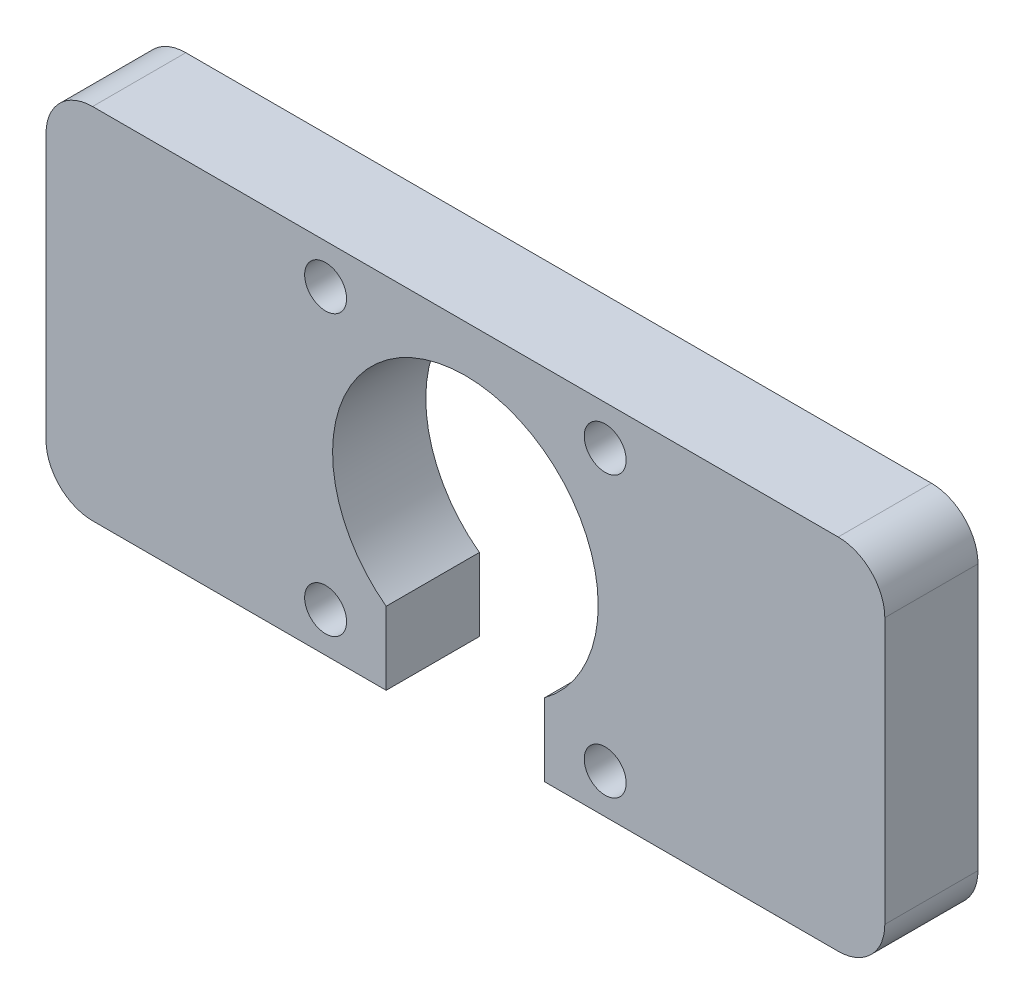
ISO-10303-21;
HEADER;
FILE_DESCRIPTION(('STEP AP214'),'2;1');
FILE_NAME('part.step','',(''),(''),'','','');
FILE_SCHEMA(('AUTOMOTIVE_DESIGN { 1 0 10303 214 1 1 1 1 }'));
ENDSEC;
DATA;
#1=APPLICATION_CONTEXT('core data for automotive mechanical design processes');
#2=APPLICATION_PROTOCOL_DEFINITION('international standard','automotive_design',2000,#1);
#3=PRODUCT_CONTEXT('',#1,'mechanical');
#4=PRODUCT('Part','Part','',(#3));
#5=PRODUCT_RELATED_PRODUCT_CATEGORY('part','',(#4));
#6=PRODUCT_DEFINITION_FORMATION('','',#4);
#7=PRODUCT_DEFINITION_CONTEXT('part definition',#1,'design');
#8=PRODUCT_DEFINITION('design','',#6,#7);
#9=PRODUCT_DEFINITION_SHAPE('','',#8);
#10=(LENGTH_UNIT() NAMED_UNIT(*) SI_UNIT(.MILLI.,.METRE.));
#11=(NAMED_UNIT(*) PLANE_ANGLE_UNIT() SI_UNIT($,.RADIAN.));
#12=(NAMED_UNIT(*) SI_UNIT($,.STERADIAN.) SOLID_ANGLE_UNIT());
#13=UNCERTAINTY_MEASURE_WITH_UNIT(LENGTH_MEASURE(1.E-05),#10,'distance_accuracy_value','');
#14=(GEOMETRIC_REPRESENTATION_CONTEXT(3) GLOBAL_UNCERTAINTY_ASSIGNED_CONTEXT((#13)) GLOBAL_UNIT_ASSIGNED_CONTEXT((#10,
#11,#12)) REPRESENTATION_CONTEXT('',''));
#15=CARTESIAN_POINT('',(0.,0.,0.));
#16=DIRECTION('',(0.,0.,1.));
#17=DIRECTION('',(1.,0.,0.));
#18=AXIS2_PLACEMENT_3D('',#15,#16,#17);
#19=CARTESIAN_POINT('',(0.,-19.2499999999987,10.));
#20=DIRECTION('',(0.,1.,0.));
#21=DIRECTION('',(0.,0.,1.));
#22=AXIS2_PLACEMENT_3D('',#19,#20,#21);
#23=PLANE('',#22);
#24=DIRECTION('',(1.,0.,0.));
#25=VECTOR('',#24,1.);
#26=CARTESIAN_POINT('',(0.,-19.2499999999987,0.));
#27=LINE('',#26,#25);
#28=CARTESIAN_POINT('',(8.5,-19.2499999999987,0.));
#29=VERTEX_POINT('',#28);
#30=CARTESIAN_POINT('',(40.0000000000002,-19.2499999999987,0.));
#31=VERTEX_POINT('',#30);
#32=EDGE_CURVE('E169',#29,#31,#27,.T.);
#33=ORIENTED_EDGE('',*,*,#32,.T.);
#34=DIRECTION('',(0.,0.,-1.));
#35=VECTOR('',#34,1.);
#36=CARTESIAN_POINT('',(40.0000000000002,-19.2499999999987,10.));
#37=LINE('',#36,#35);
#38=CARTESIAN_POINT('',(40.0000000000002,-19.2499999999987,10.));
#39=VERTEX_POINT('',#38);
#40=EDGE_CURVE('E11',#39,#31,#37,.T.);
#41=ORIENTED_EDGE('',*,*,#40,.F.);
#42=DIRECTION('',(1.,0.,0.));
#43=VECTOR('',#42,1.);
#44=CARTESIAN_POINT('',(0.,-19.2499999999987,10.));
#45=LINE('',#44,#43);
#46=CARTESIAN_POINT('',(8.5,-19.2499999999987,10.));
#47=VERTEX_POINT('',#46);
#48=EDGE_CURVE('E239',#47,#39,#45,.T.);
#49=ORIENTED_EDGE('',*,*,#48,.F.);
#50=DIRECTION('',(0.,0.,-1.));
#51=VECTOR('',#50,1.);
#52=CARTESIAN_POINT('',(8.5,-19.2499999999987,10.));
#53=LINE('',#52,#51);
#54=EDGE_CURVE('E52',#47,#29,#53,.T.);
#55=ORIENTED_EDGE('',*,*,#54,.T.);
#56=EDGE_LOOP('',(#33,#41,#49,#55));
#57=FACE_BOUND('',#56,.T.);
#58=ADVANCED_FACE('F35',(#57),#23,.F.);
#59=CARTESIAN_POINT('',(40.0000000000002,-14.2499999999987,10.));
#60=DIRECTION('',(0.,0.,-1.));
#61=DIRECTION('',(-1.,0.,0.));
#62=AXIS2_PLACEMENT_3D('',#59,#60,#61);
#63=CYLINDRICAL_SURFACE('',#62,5.);
#64=CARTESIAN_POINT('',(40.0000000000002,-14.2499999999987,0.));
#65=DIRECTION('',(0.,0.,1.));
#66=DIRECTION('',(1.,0.,0.));
#67=AXIS2_PLACEMENT_3D('',#64,#65,#66);
#68=CIRCLE('',#67,5.);
#69=CARTESIAN_POINT('',(45.0000000000002,-14.2499999999987,0.));
#70=VERTEX_POINT('',#69);
#71=EDGE_CURVE('E171',#31,#70,#68,.T.);
#72=ORIENTED_EDGE('',*,*,#71,.T.);
#73=DIRECTION('',(0.,0.,-1.));
#74=VECTOR('',#73,1.);
#75=CARTESIAN_POINT('',(45.0000000000002,-14.2499999999987,10.));
#76=LINE('',#75,#74);
#77=CARTESIAN_POINT('',(45.0000000000002,-14.2499999999987,10.));
#78=VERTEX_POINT('',#77);
#79=EDGE_CURVE('E44',#78,#70,#76,.T.);
#80=ORIENTED_EDGE('',*,*,#79,.F.);
#81=CARTESIAN_POINT('',(40.0000000000002,-14.2499999999987,10.));
#82=DIRECTION('',(0.,0.,1.));
#83=DIRECTION('',(1.,0.,0.));
#84=AXIS2_PLACEMENT_3D('',#81,#82,#83);
#85=CIRCLE('',#84,5.);
#86=EDGE_CURVE('E102',#39,#78,#85,.T.);
#87=ORIENTED_EDGE('',*,*,#86,.F.);
#88=ORIENTED_EDGE('',*,*,#40,.T.);
#89=EDGE_LOOP('',(#72,#80,#87,#88));
#90=FACE_BOUND('',#89,.T.);
#91=ADVANCED_FACE('F222',(#90),#63,.T.);
#92=CARTESIAN_POINT('',(45.0000000000002,0.,10.));
#93=DIRECTION('',(1.,0.,0.));
#94=DIRECTION('',(0.,0.,-1.));
#95=AXIS2_PLACEMENT_3D('',#92,#93,#94);
#96=PLANE('',#95);
#97=DIRECTION('',(0.,-1.,0.));
#98=VECTOR('',#97,1.);
#99=CARTESIAN_POINT('',(45.0000000000002,0.,0.));
#100=LINE('',#99,#98);
#101=CARTESIAN_POINT('',(45.0000000000002,14.2499999999981,0.));
#102=VERTEX_POINT('',#101);
#103=EDGE_CURVE('E174',#102,#70,#100,.T.);
#104=ORIENTED_EDGE('',*,*,#103,.F.);
#105=DIRECTION('',(0.,0.,-1.));
#106=VECTOR('',#105,1.);
#107=CARTESIAN_POINT('',(45.0000000000002,14.2499999999981,10.));
#108=LINE('',#107,#106);
#109=CARTESIAN_POINT('',(45.0000000000002,14.2499999999981,10.));
#110=VERTEX_POINT('',#109);
#111=EDGE_CURVE('E215',#110,#102,#108,.T.);
#112=ORIENTED_EDGE('',*,*,#111,.F.);
#113=DIRECTION('',(0.,-1.,0.));
#114=VECTOR('',#113,1.);
#115=CARTESIAN_POINT('',(45.0000000000002,0.,10.));
#116=LINE('',#115,#114);
#117=EDGE_CURVE('E221',#110,#78,#116,.T.);
#118=ORIENTED_EDGE('',*,*,#117,.T.);
#119=ORIENTED_EDGE('',*,*,#79,.T.);
#120=EDGE_LOOP('',(#104,#112,#118,#119));
#121=FACE_BOUND('',#120,.T.);
#122=ADVANCED_FACE('F219',(#121),#96,.T.);
#123=CARTESIAN_POINT('',(40.0000000000002,14.2499999999982,10.));
#124=DIRECTION('',(0.,0.,-1.));
#125=DIRECTION('',(-1.,0.,0.));
#126=AXIS2_PLACEMENT_3D('',#123,#124,#125);
#127=CYLINDRICAL_SURFACE('',#126,5.);
#128=CARTESIAN_POINT('',(40.0000000000002,14.2499999999982,0.));
#129=DIRECTION('',(0.,0.,1.));
#130=DIRECTION('',(1.,0.,0.));
#131=AXIS2_PLACEMENT_3D('',#128,#129,#130);
#132=CIRCLE('',#131,5.);
#133=CARTESIAN_POINT('',(40.0000000000002,19.2499999999982,0.));
#134=VERTEX_POINT('',#133);
#135=EDGE_CURVE('E177',#134,#102,#132,.F.);
#136=ORIENTED_EDGE('',*,*,#135,.F.);
#137=DIRECTION('',(0.,0.,-1.));
#138=VECTOR('',#137,1.);
#139=CARTESIAN_POINT('',(40.0000000000002,19.2499999999982,10.));
#140=LINE('',#139,#138);
#141=CARTESIAN_POINT('',(40.0000000000002,19.2499999999982,10.));
#142=VERTEX_POINT('',#141);
#143=EDGE_CURVE('E213',#142,#134,#140,.T.);
#144=ORIENTED_EDGE('',*,*,#143,.F.);
#145=CARTESIAN_POINT('',(40.0000000000002,14.2499999999982,10.));
#146=DIRECTION('',(0.,0.,1.));
#147=DIRECTION('',(1.,0.,0.));
#148=AXIS2_PLACEMENT_3D('',#145,#146,#147);
#149=CIRCLE('',#148,5.);
#150=EDGE_CURVE('E233',#142,#110,#149,.F.);
#151=ORIENTED_EDGE('',*,*,#150,.T.);
#152=ORIENTED_EDGE('',*,*,#111,.T.);
#153=EDGE_LOOP('',(#136,#144,#151,#152));
#154=FACE_BOUND('',#153,.T.);
#155=ADVANCED_FACE('F230',(#154),#127,.T.);
#156=CARTESIAN_POINT('',(0.,19.2499999999982,10.));
#157=DIRECTION('',(0.,1.,0.));
#158=DIRECTION('',(0.,0.,1.));
#159=AXIS2_PLACEMENT_3D('',#156,#157,#158);
#160=PLANE('',#159);
#161=DIRECTION('',(1.,0.,0.));
#162=VECTOR('',#161,1.);
#163=CARTESIAN_POINT('',(0.,19.2499999999982,0.));
#164=LINE('',#163,#162);
#165=CARTESIAN_POINT('',(-40.0000000000002,19.2499999999982,0.));
#166=VERTEX_POINT('',#165);
#167=EDGE_CURVE('E180',#166,#134,#164,.T.);
#168=ORIENTED_EDGE('',*,*,#167,.F.);
#169=DIRECTION('',(0.,0.,-1.));
#170=VECTOR('',#169,1.);
#171=CARTESIAN_POINT('',(-40.0000000000002,19.2499999999982,10.));
#172=LINE('',#171,#170);
#173=CARTESIAN_POINT('',(-40.0000000000002,19.2499999999982,10.));
#174=VERTEX_POINT('',#173);
#175=EDGE_CURVE('E211',#174,#166,#172,.T.);
#176=ORIENTED_EDGE('',*,*,#175,.F.);
#177=DIRECTION('',(1.,0.,0.));
#178=VECTOR('',#177,1.);
#179=CARTESIAN_POINT('',(0.,19.2499999999982,10.));
#180=LINE('',#179,#178);
#181=EDGE_CURVE('E237',#174,#142,#180,.T.);
#182=ORIENTED_EDGE('',*,*,#181,.T.);
#183=ORIENTED_EDGE('',*,*,#143,.T.);
#184=EDGE_LOOP('',(#168,#176,#182,#183));
#185=FACE_BOUND('',#184,.T.);
#186=ADVANCED_FACE('F391',(#185),#160,.T.);
#187=CARTESIAN_POINT('',(-40.0000000000002,14.2499999999982,10.));
#188=DIRECTION('',(0.,0.,-1.));
#189=DIRECTION('',(-1.,0.,0.));
#190=AXIS2_PLACEMENT_3D('',#187,#188,#189);
#191=CYLINDRICAL_SURFACE('',#190,5.);
#192=CARTESIAN_POINT('',(-40.0000000000002,14.2499999999982,0.));
#193=DIRECTION('',(0.,0.,1.));
#194=DIRECTION('',(1.,0.,0.));
#195=AXIS2_PLACEMENT_3D('',#192,#193,#194);
#196=CIRCLE('',#195,5.);
#197=CARTESIAN_POINT('',(-45.0000000000002,14.2499999999981,0.));
#198=VERTEX_POINT('',#197);
#199=EDGE_CURVE('E183',#166,#198,#196,.T.);
#200=ORIENTED_EDGE('',*,*,#199,.T.);
#201=DIRECTION('',(0.,0.,-1.));
#202=VECTOR('',#201,1.);
#203=CARTESIAN_POINT('',(-45.0000000000002,14.2499999999981,10.));
#204=LINE('',#203,#202);
#205=CARTESIAN_POINT('',(-45.0000000000002,14.2499999999981,10.));
#206=VERTEX_POINT('',#205);
#207=EDGE_CURVE('E208',#206,#198,#204,.T.);
#208=ORIENTED_EDGE('',*,*,#207,.F.);
#209=CARTESIAN_POINT('',(-40.0000000000002,14.2499999999982,10.));
#210=DIRECTION('',(0.,0.,1.));
#211=DIRECTION('',(1.,0.,0.));
#212=AXIS2_PLACEMENT_3D('',#209,#210,#211);
#213=CIRCLE('',#212,5.);
#214=EDGE_CURVE('E244',#174,#206,#213,.T.);
#215=ORIENTED_EDGE('',*,*,#214,.F.);
#216=ORIENTED_EDGE('',*,*,#175,.T.);
#217=EDGE_LOOP('',(#200,#208,#215,#216));
#218=FACE_BOUND('',#217,.T.);
#219=ADVANCED_FACE('F381',(#218),#191,.T.);
#220=CARTESIAN_POINT('',(-45.0000000000002,0.,10.));
#221=DIRECTION('',(1.,0.,0.));
#222=DIRECTION('',(0.,0.,-1.));
#223=AXIS2_PLACEMENT_3D('',#220,#221,#222);
#224=PLANE('',#223);
#225=DIRECTION('',(0.,-1.,0.));
#226=VECTOR('',#225,1.);
#227=CARTESIAN_POINT('',(-45.0000000000002,0.,0.));
#228=LINE('',#227,#226);
#229=CARTESIAN_POINT('',(-45.0000000000002,-14.2499999999987,0.));
#230=VERTEX_POINT('',#229);
#231=EDGE_CURVE('E185',#198,#230,#228,.T.);
#232=ORIENTED_EDGE('',*,*,#231,.T.);
#233=DIRECTION('',(0.,0.,-1.));
#234=VECTOR('',#233,1.);
#235=CARTESIAN_POINT('',(-45.0000000000002,-14.2499999999987,10.));
#236=LINE('',#235,#234);
#237=CARTESIAN_POINT('',(-45.0000000000002,-14.2499999999987,10.));
#238=VERTEX_POINT('',#237);
#239=EDGE_CURVE('E206',#238,#230,#236,.T.);
#240=ORIENTED_EDGE('',*,*,#239,.F.);
#241=DIRECTION('',(0.,-1.,0.));
#242=VECTOR('',#241,1.);
#243=CARTESIAN_POINT('',(-45.0000000000002,0.,10.));
#244=LINE('',#243,#242);
#245=EDGE_CURVE('E246',#206,#238,#244,.T.);
#246=ORIENTED_EDGE('',*,*,#245,.F.);
#247=ORIENTED_EDGE('',*,*,#207,.T.);
#248=EDGE_LOOP('',(#232,#240,#246,#247));
#249=FACE_BOUND('',#248,.T.);
#250=ADVANCED_FACE('F370',(#249),#224,.F.);
#251=CARTESIAN_POINT('',(-40.0000000000002,-14.2499999999987,10.));
#252=DIRECTION('',(0.,0.,-1.));
#253=DIRECTION('',(-1.,0.,0.));
#254=AXIS2_PLACEMENT_3D('',#251,#252,#253);
#255=CYLINDRICAL_SURFACE('',#254,5.);
#256=CARTESIAN_POINT('',(-40.0000000000002,-14.2499999999987,0.));
#257=DIRECTION('',(0.,0.,1.));
#258=DIRECTION('',(1.,0.,0.));
#259=AXIS2_PLACEMENT_3D('',#256,#257,#258);
#260=CIRCLE('',#259,5.);
#261=CARTESIAN_POINT('',(-40.0000000000002,-19.2499999999987,0.));
#262=VERTEX_POINT('',#261);
#263=EDGE_CURVE('E188',#262,#230,#260,.F.);
#264=ORIENTED_EDGE('',*,*,#263,.F.);
#265=DIRECTION('',(0.,0.,-1.));
#266=VECTOR('',#265,1.);
#267=CARTESIAN_POINT('',(-40.0000000000002,-19.2499999999987,10.));
#268=LINE('',#267,#266);
#269=CARTESIAN_POINT('',(-40.0000000000002,-19.2499999999987,10.));
#270=VERTEX_POINT('',#269);
#271=EDGE_CURVE('E204',#270,#262,#268,.T.);
#272=ORIENTED_EDGE('',*,*,#271,.F.);
#273=CARTESIAN_POINT('',(-40.0000000000002,-14.2499999999987,10.));
#274=DIRECTION('',(0.,0.,1.));
#275=DIRECTION('',(1.,0.,0.));
#276=AXIS2_PLACEMENT_3D('',#273,#274,#275);
#277=CIRCLE('',#276,5.);
#278=EDGE_CURVE('E248',#270,#238,#277,.F.);
#279=ORIENTED_EDGE('',*,*,#278,.T.);
#280=ORIENTED_EDGE('',*,*,#239,.T.);
#281=EDGE_LOOP('',(#264,#272,#279,#280));
#282=FACE_BOUND('',#281,.T.);
#283=ADVANCED_FACE('F360',(#282),#255,.T.);
#284=CARTESIAN_POINT('',(0.,-19.2499999999987,10.));
#285=DIRECTION('',(0.,-1.,0.));
#286=DIRECTION('',(0.,0.,-1.));
#287=AXIS2_PLACEMENT_3D('',#284,#285,#286);
#288=PLANE('',#287);
#289=DIRECTION('',(-1.,0.,0.));
#290=VECTOR('',#289,1.);
#291=CARTESIAN_POINT('',(0.,-19.2499999999987,0.));
#292=LINE('',#291,#290);
#293=CARTESIAN_POINT('',(-8.49999999999999,-19.2499999999987,0.));
#294=VERTEX_POINT('',#293);
#295=EDGE_CURVE('E191',#294,#262,#292,.T.);
#296=ORIENTED_EDGE('',*,*,#295,.F.);
#297=DIRECTION('',(0.,0.,-1.));
#298=VECTOR('',#297,1.);
#299=CARTESIAN_POINT('',(-8.49999999999999,-19.2499999999987,10.));
#300=LINE('',#299,#298);
#301=CARTESIAN_POINT('',(-8.49999999999999,-19.2499999999987,10.));
#302=VERTEX_POINT('',#301);
#303=EDGE_CURVE('E139',#302,#294,#300,.T.);
#304=ORIENTED_EDGE('',*,*,#303,.F.);
#305=DIRECTION('',(-1.,0.,0.));
#306=VECTOR('',#305,1.);
#307=CARTESIAN_POINT('',(0.,-19.2499999999987,10.));
#308=LINE('',#307,#306);
#309=EDGE_CURVE('E149',#302,#270,#308,.T.);
#310=ORIENTED_EDGE('',*,*,#309,.T.);
#311=ORIENTED_EDGE('',*,*,#271,.T.);
#312=EDGE_LOOP('',(#296,#304,#310,#311));
#313=FACE_BOUND('',#312,.T.);
#314=ADVANCED_FACE('F252',(#313),#288,.T.);
#315=CARTESIAN_POINT('',(-8.50000000000002,0.,10.));
#316=DIRECTION('',(1.,0.,0.));
#317=DIRECTION('',(0.,1.,0.));
#318=AXIS2_PLACEMENT_3D('',#315,#316,#317);
#319=PLANE('',#318);
#320=DIRECTION('',(0.,-1.,0.));
#321=VECTOR('',#320,1.);
#322=CARTESIAN_POINT('',(-8.50000000000002,0.,0.));
#323=LINE('',#322,#321);
#324=CARTESIAN_POINT('',(-8.5,-11.4373292336979,0.));
#325=VERTEX_POINT('',#324);
#326=EDGE_CURVE('E135',#325,#294,#323,.T.);
#327=ORIENTED_EDGE('',*,*,#326,.F.);
#328=DIRECTION('',(0.,0.,-1.));
#329=VECTOR('',#328,1.);
#330=CARTESIAN_POINT('',(-8.5,-11.4373292336979,10.));
#331=LINE('',#330,#329);
#332=CARTESIAN_POINT('',(-8.5,-11.4373292336979,10.));
#333=VERTEX_POINT('',#332);
#334=EDGE_CURVE('E130',#333,#325,#331,.T.);
#335=ORIENTED_EDGE('',*,*,#334,.F.);
#336=DIRECTION('',(0.,-1.,0.));
#337=VECTOR('',#336,1.);
#338=CARTESIAN_POINT('',(-8.50000000000002,0.,10.));
#339=LINE('',#338,#337);
#340=EDGE_CURVE('E133',#333,#302,#339,.T.);
#341=ORIENTED_EDGE('',*,*,#340,.T.);
#342=ORIENTED_EDGE('',*,*,#303,.T.);
#343=EDGE_LOOP('',(#327,#335,#341,#342));
#344=FACE_BOUND('',#343,.T.);
#345=ADVANCED_FACE('F132',(#344),#319,.T.);
#346=CARTESIAN_POINT('',(0.,0.,10.));
#347=DIRECTION('',(0.,0.,-1.));
#348=DIRECTION('',(-1.,0.,0.));
#349=AXIS2_PLACEMENT_3D('',#346,#347,#348);
#350=CYLINDRICAL_SURFACE('',#349,14.25);
#351=CARTESIAN_POINT('',(0.,0.,0.));
#352=DIRECTION('',(0.,0.,1.));
#353=DIRECTION('',(1.,0.,0.));
#354=AXIS2_PLACEMENT_3D('',#351,#352,#353);
#355=CIRCLE('',#354,14.25);
#356=CARTESIAN_POINT('',(8.5,-11.4373292336979,0.));
#357=VERTEX_POINT('',#356);
#358=EDGE_CURVE('E195',#357,#325,#355,.T.);
#359=ORIENTED_EDGE('',*,*,#358,.F.);
#360=DIRECTION('',(0.,0.,-1.));
#361=VECTOR('',#360,1.);
#362=CARTESIAN_POINT('',(8.5,-11.4373292336979,10.));
#363=LINE('',#362,#361);
#364=CARTESIAN_POINT('',(8.5,-11.4373292336979,10.));
#365=VERTEX_POINT('',#364);
#366=EDGE_CURVE('E90',#365,#357,#363,.T.);
#367=ORIENTED_EDGE('',*,*,#366,.F.);
#368=CARTESIAN_POINT('',(0.,0.,10.));
#369=DIRECTION('',(0.,0.,1.));
#370=DIRECTION('',(1.,0.,0.));
#371=AXIS2_PLACEMENT_3D('',#368,#369,#370);
#372=CIRCLE('',#371,14.25);
#373=EDGE_CURVE('E146',#365,#333,#372,.T.);
#374=ORIENTED_EDGE('',*,*,#373,.T.);
#375=ORIENTED_EDGE('',*,*,#334,.T.);
#376=EDGE_LOOP('',(#359,#367,#374,#375));
#377=FACE_BOUND('',#376,.T.);
#378=ADVANCED_FACE('F151',(#377),#350,.F.);
#379=CARTESIAN_POINT('',(15.0000000000002,-14.9999999999982,10.));
#380=DIRECTION('',(0.,0.,-1.));
#381=DIRECTION('',(-1.,0.,0.));
#382=AXIS2_PLACEMENT_3D('',#379,#380,#381);
#383=CYLINDRICAL_SURFACE('',#382,2.24999999999958);
#384=CARTESIAN_POINT('',(15.0000000000002,-14.9999999999982,10.));
#385=DIRECTION('',(0.,0.,1.));
#386=DIRECTION('',(1.,0.,0.));
#387=AXIS2_PLACEMENT_3D('',#384,#385,#386);
#388=CIRCLE('',#387,2.24999999999958);
#389=CARTESIAN_POINT('',(17.2499999999998,-14.9999999999982,10.));
#390=VERTEX_POINT('',#389);
#391=EDGE_CURVE('E467',#390,#390,#388,.T.);
#392=ORIENTED_EDGE('',*,*,#391,.T.);
#393=EDGE_LOOP('',(#392));
#394=FACE_BOUND('',#393,.T.);
#395=CARTESIAN_POINT('',(15.0000000000002,-14.9999999999982,0.));
#396=DIRECTION('',(0.,0.,1.));
#397=DIRECTION('',(1.,0.,0.));
#398=AXIS2_PLACEMENT_3D('',#395,#396,#397);
#399=CIRCLE('',#398,2.24999999999958);
#400=CARTESIAN_POINT('',(17.2499999999998,-14.9999999999982,0.));
#401=VERTEX_POINT('',#400);
#402=EDGE_CURVE('E166',#401,#401,#399,.T.);
#403=ORIENTED_EDGE('',*,*,#402,.F.);
#404=EDGE_LOOP('',(#403));
#405=FACE_BOUND('',#404,.T.);
#406=ADVANCED_FACE('F275',(#394,#405),#383,.F.);
#407=CARTESIAN_POINT('',(-14.999999999995,-14.9999999999984,10.));
#408=DIRECTION('',(0.,0.,-1.));
#409=DIRECTION('',(-1.,0.,0.));
#410=AXIS2_PLACEMENT_3D('',#407,#408,#409);
#411=CYLINDRICAL_SURFACE('',#410,2.24999999999502);
#412=CARTESIAN_POINT('',(-14.999999999995,-14.9999999999984,10.));
#413=DIRECTION('',(0.,0.,1.));
#414=DIRECTION('',(1.,0.,0.));
#415=AXIS2_PLACEMENT_3D('',#412,#413,#414);
#416=CIRCLE('',#415,2.24999999999502);
#417=CARTESIAN_POINT('',(-12.75,-14.9999999999984,10.));
#418=VERTEX_POINT('',#417);
#419=EDGE_CURVE('E464',#418,#418,#416,.T.);
#420=ORIENTED_EDGE('',*,*,#419,.T.);
#421=EDGE_LOOP('',(#420));
#422=FACE_BOUND('',#421,.T.);
#423=CARTESIAN_POINT('',(-14.999999999995,-14.9999999999984,0.));
#424=DIRECTION('',(0.,0.,1.));
#425=DIRECTION('',(1.,0.,0.));
#426=AXIS2_PLACEMENT_3D('',#423,#424,#425);
#427=CIRCLE('',#426,2.24999999999502);
#428=CARTESIAN_POINT('',(-12.75,-14.9999999999984,0.));
#429=VERTEX_POINT('',#428);
#430=EDGE_CURVE('E163',#429,#429,#427,.T.);
#431=ORIENTED_EDGE('',*,*,#430,.F.);
#432=EDGE_LOOP('',(#431));
#433=FACE_BOUND('',#432,.T.);
#434=ADVANCED_FACE('F278',(#422,#433),#411,.F.);
#435=CARTESIAN_POINT('',(-14.999999999995,14.9999999999975,10.));
#436=DIRECTION('',(0.,0.,-1.));
#437=DIRECTION('',(-1.,0.,0.));
#438=AXIS2_PLACEMENT_3D('',#435,#436,#437);
#439=CYLINDRICAL_SURFACE('',#438,2.24999999999594);
#440=CARTESIAN_POINT('',(-14.999999999995,14.9999999999975,10.));
#441=DIRECTION('',(0.,0.,1.));
#442=DIRECTION('',(1.,0.,0.));
#443=AXIS2_PLACEMENT_3D('',#440,#441,#442);
#444=CIRCLE('',#443,2.24999999999594);
#445=CARTESIAN_POINT('',(-12.7499999999991,14.9999999999975,10.));
#446=VERTEX_POINT('',#445);
#447=EDGE_CURVE('E289',#446,#446,#444,.T.);
#448=ORIENTED_EDGE('',*,*,#447,.T.);
#449=EDGE_LOOP('',(#448));
#450=FACE_BOUND('',#449,.T.);
#451=CARTESIAN_POINT('',(-14.999999999995,14.9999999999975,0.));
#452=DIRECTION('',(0.,0.,1.));
#453=DIRECTION('',(1.,0.,0.));
#454=AXIS2_PLACEMENT_3D('',#451,#452,#453);
#455=CIRCLE('',#454,2.24999999999594);
#456=CARTESIAN_POINT('',(-12.7499999999991,14.9999999999975,0.));
#457=VERTEX_POINT('',#456);
#458=EDGE_CURVE('E160',#457,#457,#455,.T.);
#459=ORIENTED_EDGE('',*,*,#458,.F.);
#460=EDGE_LOOP('',(#459));
#461=FACE_BOUND('',#460,.T.);
#462=ADVANCED_FACE('F263',(#450,#461),#439,.F.);
#463=CARTESIAN_POINT('',(15.0000000000002,14.9999999999977,10.));
#464=DIRECTION('',(0.,0.,-1.));
#465=DIRECTION('',(-1.,0.,0.));
#466=AXIS2_PLACEMENT_3D('',#463,#464,#465);
#467=CYLINDRICAL_SURFACE('',#466,2.25000000000049);
#468=CARTESIAN_POINT('',(15.0000000000002,14.9999999999977,10.));
#469=DIRECTION('',(0.,0.,1.));
#470=DIRECTION('',(1.,0.,0.));
#471=AXIS2_PLACEMENT_3D('',#468,#469,#470);
#472=CIRCLE('',#471,2.25000000000049);
#473=CARTESIAN_POINT('',(17.2500000000007,14.9999999999977,10.));
#474=VERTEX_POINT('',#473);
#475=EDGE_CURVE('E200',#474,#474,#472,.T.);
#476=ORIENTED_EDGE('',*,*,#475,.T.);
#477=EDGE_LOOP('',(#476));
#478=FACE_BOUND('',#477,.T.);
#479=CARTESIAN_POINT('',(15.0000000000002,14.9999999999977,0.));
#480=DIRECTION('',(0.,0.,1.));
#481=DIRECTION('',(1.,0.,0.));
#482=AXIS2_PLACEMENT_3D('',#479,#480,#481);
#483=CIRCLE('',#482,2.25000000000049);
#484=CARTESIAN_POINT('',(17.2500000000007,14.9999999999977,0.));
#485=VERTEX_POINT('',#484);
#486=EDGE_CURVE('E157',#485,#485,#483,.T.);
#487=ORIENTED_EDGE('',*,*,#486,.F.);
#488=EDGE_LOOP('',(#487));
#489=FACE_BOUND('',#488,.T.);
#490=ADVANCED_FACE('F37',(#478,#489),#467,.F.);
#491=CARTESIAN_POINT('',(8.5,0.,10.));
#492=DIRECTION('',(-1.,0.,0.));
#493=DIRECTION('',(0.,0.,1.));
#494=AXIS2_PLACEMENT_3D('',#491,#492,#493);
#495=PLANE('',#494);
#496=DIRECTION('',(0.,1.,0.));
#497=VECTOR('',#496,1.);
#498=CARTESIAN_POINT('',(8.5,0.,0.));
#499=LINE('',#498,#497);
#500=EDGE_CURVE('E197',#29,#357,#499,.T.);
#501=ORIENTED_EDGE('',*,*,#500,.F.);
#502=ORIENTED_EDGE('',*,*,#54,.F.);
#503=DIRECTION('',(0.,1.,0.));
#504=VECTOR('',#503,1.);
#505=CARTESIAN_POINT('',(8.5,0.,10.));
#506=LINE('',#505,#504);
#507=EDGE_CURVE('E152',#47,#365,#506,.T.);
#508=ORIENTED_EDGE('',*,*,#507,.T.);
#509=ORIENTED_EDGE('',*,*,#366,.T.);
#510=EDGE_LOOP('',(#501,#502,#508,#509));
#511=FACE_BOUND('',#510,.T.);
#512=ADVANCED_FACE('F254',(#511),#495,.T.);
#513=CARTESIAN_POINT('',(0.,0.,10.));
#514=DIRECTION('',(0.,0.,1.));
#515=DIRECTION('',(1.,0.,0.));
#516=AXIS2_PLACEMENT_3D('',#513,#514,#515);
#517=PLANE('',#516);
#518=ORIENTED_EDGE('',*,*,#475,.F.);
#519=EDGE_LOOP('',(#518));
#520=FACE_BOUND('',#519,.T.);
#521=ORIENTED_EDGE('',*,*,#447,.F.);
#522=EDGE_LOOP('',(#521));
#523=FACE_BOUND('',#522,.T.);
#524=ORIENTED_EDGE('',*,*,#419,.F.);
#525=EDGE_LOOP('',(#524));
#526=FACE_BOUND('',#525,.T.);
#527=ORIENTED_EDGE('',*,*,#391,.F.);
#528=EDGE_LOOP('',(#527));
#529=FACE_BOUND('',#528,.T.);
#530=ORIENTED_EDGE('',*,*,#48,.T.);
#531=ORIENTED_EDGE('',*,*,#86,.T.);
#532=ORIENTED_EDGE('',*,*,#117,.F.);
#533=ORIENTED_EDGE('',*,*,#150,.F.);
#534=ORIENTED_EDGE('',*,*,#181,.F.);
#535=ORIENTED_EDGE('',*,*,#214,.T.);
#536=ORIENTED_EDGE('',*,*,#245,.T.);
#537=ORIENTED_EDGE('',*,*,#278,.F.);
#538=ORIENTED_EDGE('',*,*,#309,.F.);
#539=ORIENTED_EDGE('',*,*,#340,.F.);
#540=ORIENTED_EDGE('',*,*,#373,.F.);
#541=ORIENTED_EDGE('',*,*,#507,.F.);
#542=EDGE_LOOP('',(#530,#531,#532,#533,#534,#535,#536,#537,#538,#539,#540,#541));
#543=FACE_BOUND('',#542,.T.);
#544=ADVANCED_FACE('F144',(#520,#523,#526,#529,#543),#517,.T.);
#545=CARTESIAN_POINT('',(0.,0.,0.));
#546=DIRECTION('',(0.,0.,1.));
#547=DIRECTION('',(1.,0.,0.));
#548=AXIS2_PLACEMENT_3D('',#545,#546,#547);
#549=PLANE('',#548);
#550=ORIENTED_EDGE('',*,*,#486,.T.);
#551=EDGE_LOOP('',(#550));
#552=FACE_BOUND('',#551,.T.);
#553=ORIENTED_EDGE('',*,*,#458,.T.);
#554=EDGE_LOOP('',(#553));
#555=FACE_BOUND('',#554,.T.);
#556=ORIENTED_EDGE('',*,*,#430,.T.);
#557=EDGE_LOOP('',(#556));
#558=FACE_BOUND('',#557,.T.);
#559=ORIENTED_EDGE('',*,*,#402,.T.);
#560=EDGE_LOOP('',(#559));
#561=FACE_BOUND('',#560,.T.);
#562=ORIENTED_EDGE('',*,*,#32,.F.);
#563=ORIENTED_EDGE('',*,*,#500,.T.);
#564=ORIENTED_EDGE('',*,*,#358,.T.);
#565=ORIENTED_EDGE('',*,*,#326,.T.);
#566=ORIENTED_EDGE('',*,*,#295,.T.);
#567=ORIENTED_EDGE('',*,*,#263,.T.);
#568=ORIENTED_EDGE('',*,*,#231,.F.);
#569=ORIENTED_EDGE('',*,*,#199,.F.);
#570=ORIENTED_EDGE('',*,*,#167,.T.);
#571=ORIENTED_EDGE('',*,*,#135,.T.);
#572=ORIENTED_EDGE('',*,*,#103,.T.);
#573=ORIENTED_EDGE('',*,*,#71,.F.);
#574=EDGE_LOOP('',(#562,#563,#564,#565,#566,#567,#568,#569,#570,#571,#572,#573));
#575=FACE_BOUND('',#574,.T.);
#576=ADVANCED_FACE('F225',(#552,#555,#558,#561,#575),#549,.F.);
#577=CLOSED_SHELL('',(#58,#91,#122,#155,#186,#219,#250,#283,#314,#345,#378,#406,#434,#462,#490,
#512,#544,#576));
#578=MANIFOLD_SOLID_BREP('B2',#577);
#579=ADVANCED_BREP_SHAPE_REPRESENTATION('',(#18,#578),#14);
#580=SHAPE_DEFINITION_REPRESENTATION(#9,#579);
ENDSEC;
END-ISO-10303-21;
